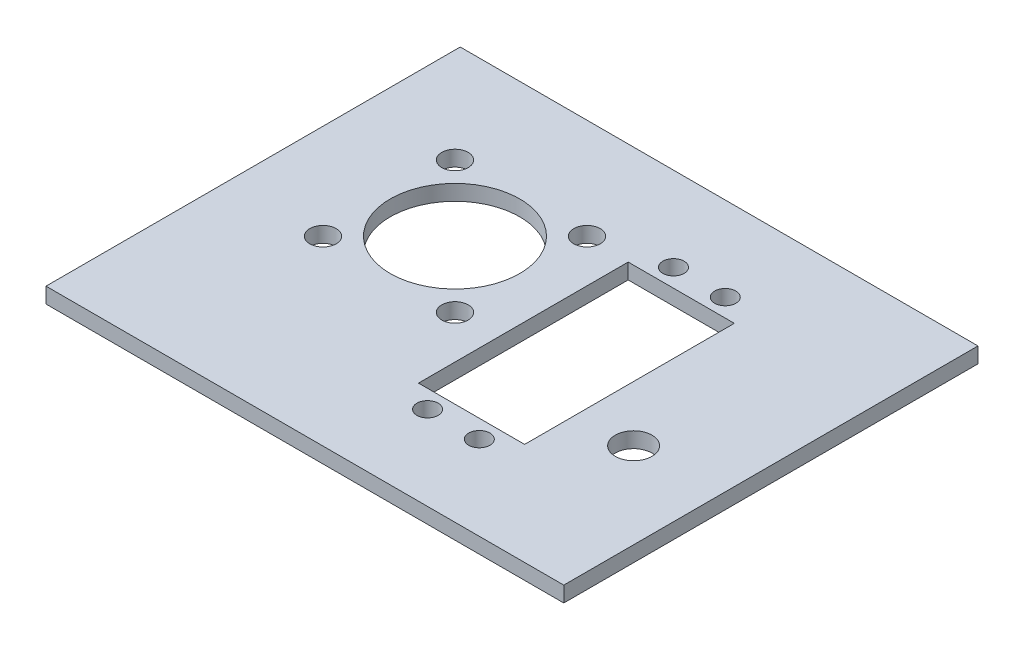
ISO-10303-21;
HEADER;
FILE_DESCRIPTION(('STEP AP214'),'2;1');
FILE_NAME('part.step','',(''),(''),'','','');
FILE_SCHEMA(('AUTOMOTIVE_DESIGN { 1 0 10303 214 1 1 1 1 }'));
ENDSEC;
DATA;
#1=APPLICATION_CONTEXT('core data for automotive mechanical design processes');
#2=APPLICATION_PROTOCOL_DEFINITION('international standard','automotive_design',2000,#1);
#3=PRODUCT_CONTEXT('',#1,'mechanical');
#4=PRODUCT('Part','Part','',(#3));
#5=PRODUCT_RELATED_PRODUCT_CATEGORY('part','',(#4));
#6=PRODUCT_DEFINITION_FORMATION('','',#4);
#7=PRODUCT_DEFINITION_CONTEXT('part definition',#1,'design');
#8=PRODUCT_DEFINITION('design','',#6,#7);
#9=PRODUCT_DEFINITION_SHAPE('','',#8);
#10=(LENGTH_UNIT() NAMED_UNIT(*) SI_UNIT(.MILLI.,.METRE.));
#11=(NAMED_UNIT(*) PLANE_ANGLE_UNIT() SI_UNIT($,.RADIAN.));
#12=(NAMED_UNIT(*) SI_UNIT($,.STERADIAN.) SOLID_ANGLE_UNIT());
#13=UNCERTAINTY_MEASURE_WITH_UNIT(LENGTH_MEASURE(1.E-05),#10,'distance_accuracy_value','');
#14=(GEOMETRIC_REPRESENTATION_CONTEXT(3) GLOBAL_UNCERTAINTY_ASSIGNED_CONTEXT((#13)) GLOBAL_UNIT_ASSIGNED_CONTEXT((#10,
#11,#12)) REPRESENTATION_CONTEXT('',''));
#15=CARTESIAN_POINT('',(0.,0.,0.));
#16=DIRECTION('',(0.,0.,1.));
#17=DIRECTION('',(1.,0.,0.));
#18=AXIS2_PLACEMENT_3D('',#15,#16,#17);
#19=CARTESIAN_POINT('',(0.,3.,-11.4110340583505));
#20=DIRECTION('',(0.,0.,-1.));
#21=DIRECTION('',(-1.,0.,0.));
#22=AXIS2_PLACEMENT_3D('',#19,#20,#21);
#23=PLANE('',#22);
#24=DIRECTION('',(1.,0.,0.));
#25=VECTOR('',#24,1.);
#26=CARTESIAN_POINT('',(0.,0.,-11.4110340583505));
#27=LINE('',#26,#25);
#28=CARTESIAN_POINT('',(13.5251162978277,0.,-11.4110340583505));
#29=VERTEX_POINT('',#28);
#30=CARTESIAN_POINT('',(34.0251162978277,0.,-11.4110340583505));
#31=VERTEX_POINT('',#30);
#32=EDGE_CURVE('E182',#29,#31,#27,.T.);
#33=ORIENTED_EDGE('',*,*,#32,.T.);
#34=DIRECTION('',(0.,-1.,0.));
#35=VECTOR('',#34,1.);
#36=CARTESIAN_POINT('',(34.0251162978277,3.,-11.4110340583505));
#37=LINE('',#36,#35);
#38=CARTESIAN_POINT('',(34.0251162978277,3.,-11.4110340583505));
#39=VERTEX_POINT('',#38);
#40=EDGE_CURVE('E11',#39,#31,#37,.T.);
#41=ORIENTED_EDGE('',*,*,#40,.F.);
#42=DIRECTION('',(1.,0.,0.));
#43=VECTOR('',#42,1.);
#44=CARTESIAN_POINT('',(0.,3.,-11.4110340583505));
#45=LINE('',#44,#43);
#46=CARTESIAN_POINT('',(13.5251162978277,3.,-11.4110340583505));
#47=VERTEX_POINT('',#46);
#48=EDGE_CURVE('E123',#47,#39,#45,.T.);
#49=ORIENTED_EDGE('',*,*,#48,.F.);
#50=DIRECTION('',(0.,-1.,0.));
#51=VECTOR('',#50,1.);
#52=CARTESIAN_POINT('',(13.5251162978277,3.,-11.4110340583505));
#53=LINE('',#52,#51);
#54=EDGE_CURVE('E63',#47,#29,#53,.T.);
#55=ORIENTED_EDGE('',*,*,#54,.T.);
#56=EDGE_LOOP('',(#33,#41,#49,#55));
#57=FACE_BOUND('',#56,.T.);
#58=ADVANCED_FACE('F44',(#57),#23,.F.);
#59=CARTESIAN_POINT('',(34.0251162978277,3.,0.));
#60=DIRECTION('',(1.,0.,0.));
#61=DIRECTION('',(0.,0.,-1.));
#62=AXIS2_PLACEMENT_3D('',#59,#60,#61);
#63=PLANE('',#62);
#64=DIRECTION('',(0.,0.,1.));
#65=VECTOR('',#64,1.);
#66=CARTESIAN_POINT('',(34.0251162978277,0.,0.));
#67=LINE('',#66,#65);
#68=CARTESIAN_POINT('',(34.0251162978277,0.,29.0889659416495));
#69=VERTEX_POINT('',#68);
#70=EDGE_CURVE('E129',#31,#69,#67,.T.);
#71=ORIENTED_EDGE('',*,*,#70,.T.);
#72=DIRECTION('',(0.,-1.,0.));
#73=VECTOR('',#72,1.);
#74=CARTESIAN_POINT('',(34.0251162978277,3.,29.0889659416495));
#75=LINE('',#74,#73);
#76=CARTESIAN_POINT('',(34.0251162978277,3.,29.0889659416495));
#77=VERTEX_POINT('',#76);
#78=EDGE_CURVE('E54',#77,#69,#75,.T.);
#79=ORIENTED_EDGE('',*,*,#78,.F.);
#80=DIRECTION('',(0.,0.,1.));
#81=VECTOR('',#80,1.);
#82=CARTESIAN_POINT('',(34.0251162978277,3.,0.));
#83=LINE('',#82,#81);
#84=EDGE_CURVE('E117',#39,#77,#83,.T.);
#85=ORIENTED_EDGE('',*,*,#84,.F.);
#86=ORIENTED_EDGE('',*,*,#40,.T.);
#87=EDGE_LOOP('',(#71,#79,#85,#86));
#88=FACE_BOUND('',#87,.T.);
#89=ADVANCED_FACE('F128',(#88),#63,.F.);
#90=CARTESIAN_POINT('',(0.,3.,29.0889659416495));
#91=DIRECTION('',(0.,0.,-1.));
#92=DIRECTION('',(-1.,0.,0.));
#93=AXIS2_PLACEMENT_3D('',#90,#91,#92);
#94=PLANE('',#93);
#95=DIRECTION('',(1.,0.,0.));
#96=VECTOR('',#95,1.);
#97=CARTESIAN_POINT('',(0.,0.,29.0889659416495));
#98=LINE('',#97,#96);
#99=CARTESIAN_POINT('',(13.5251162978277,0.,29.0889659416495));
#100=VERTEX_POINT('',#99);
#101=EDGE_CURVE('E185',#100,#69,#98,.T.);
#102=ORIENTED_EDGE('',*,*,#101,.F.);
#103=DIRECTION('',(0.,-1.,0.));
#104=VECTOR('',#103,1.);
#105=CARTESIAN_POINT('',(13.5251162978277,3.,29.0889659416495));
#106=LINE('',#105,#104);
#107=CARTESIAN_POINT('',(13.5251162978277,3.,29.0889659416495));
#108=VERTEX_POINT('',#107);
#109=EDGE_CURVE('E89',#108,#100,#106,.T.);
#110=ORIENTED_EDGE('',*,*,#109,.F.);
#111=DIRECTION('',(1.,0.,0.));
#112=VECTOR('',#111,1.);
#113=CARTESIAN_POINT('',(0.,3.,29.0889659416495));
#114=LINE('',#113,#112);
#115=EDGE_CURVE('E122',#108,#77,#114,.T.);
#116=ORIENTED_EDGE('',*,*,#115,.T.);
#117=ORIENTED_EDGE('',*,*,#78,.T.);
#118=EDGE_LOOP('',(#102,#110,#116,#117));
#119=FACE_BOUND('',#118,.T.);
#120=ADVANCED_FACE('F133',(#119),#94,.T.);
#121=CARTESIAN_POINT('',(61.3367190973659,3.,0.));
#122=DIRECTION('',(1.,0.,0.));
#123=DIRECTION('',(0.,0.,-1.));
#124=AXIS2_PLACEMENT_3D('',#121,#122,#123);
#125=PLANE('',#124);
#126=DIRECTION('',(0.,0.,1.));
#127=VECTOR('',#126,1.);
#128=CARTESIAN_POINT('',(61.3367190973659,0.,0.));
#129=LINE('',#128,#127);
#130=CARTESIAN_POINT('',(61.3367190973659,0.,-31.1610340583505));
#131=VERTEX_POINT('',#130);
#132=CARTESIAN_POINT('',(61.3367190973659,0.,48.8389659416495));
#133=VERTEX_POINT('',#132);
#134=EDGE_CURVE('E170',#131,#133,#129,.T.);
#135=ORIENTED_EDGE('',*,*,#134,.F.);
#136=DIRECTION('',(0.,-1.,0.));
#137=VECTOR('',#136,1.);
#138=CARTESIAN_POINT('',(61.3367190973659,3.,-31.1610340583505));
#139=LINE('',#138,#137);
#140=CARTESIAN_POINT('',(61.3367190973659,3.,-31.1610340583505));
#141=VERTEX_POINT('',#140);
#142=EDGE_CURVE('E48',#141,#131,#139,.T.);
#143=ORIENTED_EDGE('',*,*,#142,.F.);
#144=DIRECTION('',(0.,0.,1.));
#145=VECTOR('',#144,1.);
#146=CARTESIAN_POINT('',(61.3367190973659,3.,0.));
#147=LINE('',#146,#145);
#148=CARTESIAN_POINT('',(61.3367190973659,3.,48.8389659416495));
#149=VERTEX_POINT('',#148);
#150=EDGE_CURVE('E221',#141,#149,#147,.T.);
#151=ORIENTED_EDGE('',*,*,#150,.T.);
#152=DIRECTION('',(0.,-1.,0.));
#153=VECTOR('',#152,1.);
#154=CARTESIAN_POINT('',(61.3367190973659,3.,48.8389659416495));
#155=LINE('',#154,#153);
#156=EDGE_CURVE('E136',#149,#133,#155,.T.);
#157=ORIENTED_EDGE('',*,*,#156,.T.);
#158=EDGE_LOOP('',(#135,#143,#151,#157));
#159=FACE_BOUND('',#158,.T.);
#160=ADVANCED_FACE('F206',(#159),#125,.T.);
#161=CARTESIAN_POINT('',(0.,3.,-31.1610340583505));
#162=DIRECTION('',(0.,0.,-1.));
#163=DIRECTION('',(-1.,0.,0.));
#164=AXIS2_PLACEMENT_3D('',#161,#162,#163);
#165=PLANE('',#164);
#166=DIRECTION('',(1.,0.,0.));
#167=VECTOR('',#166,1.);
#168=CARTESIAN_POINT('',(0.,0.,-31.1610340583505));
#169=LINE('',#168,#167);
#170=CARTESIAN_POINT('',(-38.6632809026341,0.,-31.1610340583505));
#171=VERTEX_POINT('',#170);
#172=EDGE_CURVE('E173',#171,#131,#169,.T.);
#173=ORIENTED_EDGE('',*,*,#172,.F.);
#174=DIRECTION('',(0.,-1.,0.));
#175=VECTOR('',#174,1.);
#176=CARTESIAN_POINT('',(-38.6632809026341,3.,-31.1610340583505));
#177=LINE('',#176,#175);
#178=CARTESIAN_POINT('',(-38.6632809026341,3.,-31.1610340583505));
#179=VERTEX_POINT('',#178);
#180=EDGE_CURVE('E196',#179,#171,#177,.T.);
#181=ORIENTED_EDGE('',*,*,#180,.F.);
#182=DIRECTION('',(1.,0.,0.));
#183=VECTOR('',#182,1.);
#184=CARTESIAN_POINT('',(0.,3.,-31.1610340583505));
#185=LINE('',#184,#183);
#186=EDGE_CURVE('E205',#179,#141,#185,.T.);
#187=ORIENTED_EDGE('',*,*,#186,.T.);
#188=ORIENTED_EDGE('',*,*,#142,.T.);
#189=EDGE_LOOP('',(#173,#181,#187,#188));
#190=FACE_BOUND('',#189,.T.);
#191=ADVANCED_FACE('F203',(#190),#165,.T.);
#192=CARTESIAN_POINT('',(-38.6632809026341,3.,0.));
#193=DIRECTION('',(1.,0.,0.));
#194=DIRECTION('',(0.,0.,-1.));
#195=AXIS2_PLACEMENT_3D('',#192,#193,#194);
#196=PLANE('',#195);
#197=DIRECTION('',(0.,0.,1.));
#198=VECTOR('',#197,1.);
#199=CARTESIAN_POINT('',(-38.6632809026341,0.,0.));
#200=LINE('',#199,#198);
#201=CARTESIAN_POINT('',(-38.6632809026341,0.,48.8389659416495));
#202=VERTEX_POINT('',#201);
#203=EDGE_CURVE('E176',#171,#202,#200,.T.);
#204=ORIENTED_EDGE('',*,*,#203,.T.);
#205=DIRECTION('',(0.,-1.,0.));
#206=VECTOR('',#205,1.);
#207=CARTESIAN_POINT('',(-38.6632809026341,3.,48.8389659416495));
#208=LINE('',#207,#206);
#209=CARTESIAN_POINT('',(-38.6632809026341,3.,48.8389659416495));
#210=VERTEX_POINT('',#209);
#211=EDGE_CURVE('E194',#210,#202,#208,.T.);
#212=ORIENTED_EDGE('',*,*,#211,.F.);
#213=DIRECTION('',(0.,0.,1.));
#214=VECTOR('',#213,1.);
#215=CARTESIAN_POINT('',(-38.6632809026341,3.,0.));
#216=LINE('',#215,#214);
#217=EDGE_CURVE('E214',#179,#210,#216,.T.);
#218=ORIENTED_EDGE('',*,*,#217,.F.);
#219=ORIENTED_EDGE('',*,*,#180,.T.);
#220=EDGE_LOOP('',(#204,#212,#218,#219));
#221=FACE_BOUND('',#220,.T.);
#222=ADVANCED_FACE('F212',(#221),#196,.F.);
#223=CARTESIAN_POINT('',(0.,3.,48.8389659416495));
#224=DIRECTION('',(0.,0.,-1.));
#225=DIRECTION('',(-1.,0.,0.));
#226=AXIS2_PLACEMENT_3D('',#223,#224,#225);
#227=PLANE('',#226);
#228=DIRECTION('',(1.,0.,0.));
#229=VECTOR('',#228,1.);
#230=CARTESIAN_POINT('',(0.,0.,48.8389659416495));
#231=LINE('',#230,#229);
#232=EDGE_CURVE('E179',#202,#133,#231,.T.);
#233=ORIENTED_EDGE('',*,*,#232,.T.);
#234=ORIENTED_EDGE('',*,*,#156,.F.);
#235=DIRECTION('',(1.,0.,0.));
#236=VECTOR('',#235,1.);
#237=CARTESIAN_POINT('',(0.,3.,48.8389659416495));
#238=LINE('',#237,#236);
#239=EDGE_CURVE('E217',#210,#149,#238,.T.);
#240=ORIENTED_EDGE('',*,*,#239,.F.);
#241=ORIENTED_EDGE('',*,*,#211,.T.);
#242=EDGE_LOOP('',(#233,#234,#240,#241));
#243=FACE_BOUND('',#242,.T.);
#244=ADVANCED_FACE('F216',(#243),#227,.F.);
#245=CARTESIAN_POINT('',(-7.51877009888325,3.,0.993104788287176));
#246=DIRECTION('',(0.,-1.,0.));
#247=DIRECTION('',(0.,0.,-1.));
#248=AXIS2_PLACEMENT_3D('',#245,#246,#247);
#249=CYLINDRICAL_SURFACE('',#248,12.5);
#250=CARTESIAN_POINT('',(-7.51877009888325,3.,0.993104788287176));
#251=DIRECTION('',(0.,1.,0.));
#252=DIRECTION('',(0.,0.,1.));
#253=AXIS2_PLACEMENT_3D('',#250,#251,#252);
#254=CIRCLE('',#253,12.5);
#255=CARTESIAN_POINT('',(-7.51877009888325,3.,13.4931047882872));
#256=VERTEX_POINT('',#255);
#257=EDGE_CURVE('E225',#256,#256,#254,.T.);
#258=ORIENTED_EDGE('',*,*,#257,.T.);
#259=EDGE_LOOP('',(#258));
#260=FACE_BOUND('',#259,.T.);
#261=CARTESIAN_POINT('',(-7.51877009888325,0.,0.993104788287176));
#262=DIRECTION('',(0.,1.,0.));
#263=DIRECTION('',(0.,0.,1.));
#264=AXIS2_PLACEMENT_3D('',#261,#262,#263);
#265=CIRCLE('',#264,12.5);
#266=CARTESIAN_POINT('',(-7.51877009888325,0.,13.4931047882872));
#267=VERTEX_POINT('',#266);
#268=EDGE_CURVE('E167',#267,#267,#265,.T.);
#269=ORIENTED_EDGE('',*,*,#268,.F.);
#270=EDGE_LOOP('',(#269));
#271=FACE_BOUND('',#270,.T.);
#272=ADVANCED_FACE('F279',(#260,#271),#249,.F.);
#273=CARTESIAN_POINT('',(-20.2687700988833,3.,-11.7568952117128));
#274=DIRECTION('',(0.,-1.,0.));
#275=DIRECTION('',(0.,0.,-1.));
#276=AXIS2_PLACEMENT_3D('',#273,#274,#275);
#277=CYLINDRICAL_SURFACE('',#276,2.55);
#278=CARTESIAN_POINT('',(-20.2687700988833,3.,-11.7568952117128));
#279=DIRECTION('',(0.,1.,0.));
#280=DIRECTION('',(0.,0.,1.));
#281=AXIS2_PLACEMENT_3D('',#278,#279,#280);
#282=CIRCLE('',#281,2.55);
#283=CARTESIAN_POINT('',(-20.2687700988833,3.,-9.20689521171283));
#284=VERTEX_POINT('',#283);
#285=EDGE_CURVE('E228',#284,#284,#282,.T.);
#286=ORIENTED_EDGE('',*,*,#285,.T.);
#287=EDGE_LOOP('',(#286));
#288=FACE_BOUND('',#287,.T.);
#289=CARTESIAN_POINT('',(-20.2687700988833,0.,-11.7568952117128));
#290=DIRECTION('',(0.,1.,0.));
#291=DIRECTION('',(0.,0.,1.));
#292=AXIS2_PLACEMENT_3D('',#289,#290,#291);
#293=CIRCLE('',#292,2.55);
#294=CARTESIAN_POINT('',(-20.2687700988833,0.,-9.20689521171283));
#295=VERTEX_POINT('',#294);
#296=EDGE_CURVE('E164',#295,#295,#293,.T.);
#297=ORIENTED_EDGE('',*,*,#296,.F.);
#298=EDGE_LOOP('',(#297));
#299=FACE_BOUND('',#298,.T.);
#300=ADVANCED_FACE('F282',(#288,#299),#277,.F.);
#301=CARTESIAN_POINT('',(5.23122990111676,3.,-11.7568952117128));
#302=DIRECTION('',(0.,-1.,0.));
#303=DIRECTION('',(0.,0.,-1.));
#304=AXIS2_PLACEMENT_3D('',#301,#302,#303);
#305=CYLINDRICAL_SURFACE('',#304,2.55);
#306=CARTESIAN_POINT('',(5.23122990111676,3.,-11.7568952117128));
#307=DIRECTION('',(0.,1.,0.));
#308=DIRECTION('',(0.,0.,1.));
#309=AXIS2_PLACEMENT_3D('',#306,#307,#308);
#310=CIRCLE('',#309,2.55);
#311=CARTESIAN_POINT('',(5.23122990111676,3.,-9.20689521171283));
#312=VERTEX_POINT('',#311);
#313=EDGE_CURVE('E231',#312,#312,#310,.T.);
#314=ORIENTED_EDGE('',*,*,#313,.T.);
#315=EDGE_LOOP('',(#314));
#316=FACE_BOUND('',#315,.T.);
#317=CARTESIAN_POINT('',(5.23122990111676,0.,-11.7568952117128));
#318=DIRECTION('',(0.,1.,0.));
#319=DIRECTION('',(0.,0.,1.));
#320=AXIS2_PLACEMENT_3D('',#317,#318,#319);
#321=CIRCLE('',#320,2.55);
#322=CARTESIAN_POINT('',(5.23122990111676,0.,-9.20689521171283));
#323=VERTEX_POINT('',#322);
#324=EDGE_CURVE('E161',#323,#323,#321,.T.);
#325=ORIENTED_EDGE('',*,*,#324,.F.);
#326=EDGE_LOOP('',(#325));
#327=FACE_BOUND('',#326,.T.);
#328=ADVANCED_FACE('F311',(#316,#327),#305,.F.);
#329=CARTESIAN_POINT('',(5.23122990111676,3.,13.7431047882872));
#330=DIRECTION('',(0.,-1.,0.));
#331=DIRECTION('',(0.,0.,-1.));
#332=AXIS2_PLACEMENT_3D('',#329,#330,#331);
#333=CYLINDRICAL_SURFACE('',#332,2.55);
#334=CARTESIAN_POINT('',(5.23122990111676,3.,13.7431047882872));
#335=DIRECTION('',(0.,1.,0.));
#336=DIRECTION('',(0.,0.,1.));
#337=AXIS2_PLACEMENT_3D('',#334,#335,#336);
#338=CIRCLE('',#337,2.55);
#339=CARTESIAN_POINT('',(5.23122990111676,3.,16.2931047882872));
#340=VERTEX_POINT('',#339);
#341=EDGE_CURVE('E234',#340,#340,#338,.T.);
#342=ORIENTED_EDGE('',*,*,#341,.T.);
#343=EDGE_LOOP('',(#342));
#344=FACE_BOUND('',#343,.T.);
#345=CARTESIAN_POINT('',(5.23122990111676,0.,13.7431047882872));
#346=DIRECTION('',(0.,1.,0.));
#347=DIRECTION('',(0.,0.,1.));
#348=AXIS2_PLACEMENT_3D('',#345,#346,#347);
#349=CIRCLE('',#348,2.55);
#350=CARTESIAN_POINT('',(5.23122990111676,0.,16.2931047882872));
#351=VERTEX_POINT('',#350);
#352=EDGE_CURVE('E158',#351,#351,#349,.T.);
#353=ORIENTED_EDGE('',*,*,#352,.F.);
#354=EDGE_LOOP('',(#353));
#355=FACE_BOUND('',#354,.T.);
#356=ADVANCED_FACE('F315',(#344,#355),#333,.F.);
#357=CARTESIAN_POINT('',(-20.2687700988832,3.,13.7431047882872));
#358=DIRECTION('',(0.,-1.,0.));
#359=DIRECTION('',(0.,0.,-1.));
#360=AXIS2_PLACEMENT_3D('',#357,#358,#359);
#361=CYLINDRICAL_SURFACE('',#360,2.55);
#362=CARTESIAN_POINT('',(-20.2687700988832,3.,13.7431047882872));
#363=DIRECTION('',(0.,1.,0.));
#364=DIRECTION('',(0.,0.,1.));
#365=AXIS2_PLACEMENT_3D('',#362,#363,#364);
#366=CIRCLE('',#365,2.55);
#367=CARTESIAN_POINT('',(-20.2687700988832,3.,16.2931047882872));
#368=VERTEX_POINT('',#367);
#369=EDGE_CURVE('E237',#368,#368,#366,.T.);
#370=ORIENTED_EDGE('',*,*,#369,.T.);
#371=EDGE_LOOP('',(#370));
#372=FACE_BOUND('',#371,.T.);
#373=CARTESIAN_POINT('',(-20.2687700988832,0.,13.7431047882872));
#374=DIRECTION('',(0.,1.,0.));
#375=DIRECTION('',(0.,0.,1.));
#376=AXIS2_PLACEMENT_3D('',#373,#374,#375);
#377=CIRCLE('',#376,2.55);
#378=CARTESIAN_POINT('',(-20.2687700988832,0.,16.2931047882872));
#379=VERTEX_POINT('',#378);
#380=EDGE_CURVE('E155',#379,#379,#377,.T.);
#381=ORIENTED_EDGE('',*,*,#380,.F.);
#382=EDGE_LOOP('',(#381));
#383=FACE_BOUND('',#382,.T.);
#384=ADVANCED_FACE('F319',(#372,#383),#361,.F.);
#385=CARTESIAN_POINT('',(18.7751162978277,3.,-14.9110340583505));
#386=DIRECTION('',(0.,-1.,0.));
#387=DIRECTION('',(0.,0.,-1.));
#388=AXIS2_PLACEMENT_3D('',#385,#386,#387);
#389=CYLINDRICAL_SURFACE('',#388,2.05);
#390=CARTESIAN_POINT('',(18.7751162978277,3.,-14.9110340583505));
#391=DIRECTION('',(0.,1.,0.));
#392=DIRECTION('',(0.,0.,1.));
#393=AXIS2_PLACEMENT_3D('',#390,#391,#392);
#394=CIRCLE('',#393,2.05);
#395=CARTESIAN_POINT('',(18.7751162978277,3.,-12.8610340583505));
#396=VERTEX_POINT('',#395);
#397=EDGE_CURVE('E240',#396,#396,#394,.T.);
#398=ORIENTED_EDGE('',*,*,#397,.T.);
#399=EDGE_LOOP('',(#398));
#400=FACE_BOUND('',#399,.T.);
#401=CARTESIAN_POINT('',(18.7751162978277,0.,-14.9110340583505));
#402=DIRECTION('',(0.,1.,0.));
#403=DIRECTION('',(0.,0.,1.));
#404=AXIS2_PLACEMENT_3D('',#401,#402,#403);
#405=CIRCLE('',#404,2.05);
#406=CARTESIAN_POINT('',(18.7751162978277,0.,-12.8610340583505));
#407=VERTEX_POINT('',#406);
#408=EDGE_CURVE('E152',#407,#407,#405,.T.);
#409=ORIENTED_EDGE('',*,*,#408,.F.);
#410=EDGE_LOOP('',(#409));
#411=FACE_BOUND('',#410,.T.);
#412=ADVANCED_FACE('F323',(#400,#411),#389,.F.);
#413=CARTESIAN_POINT('',(28.7751162978277,3.,-14.9110340583505));
#414=DIRECTION('',(0.,-1.,0.));
#415=DIRECTION('',(0.,0.,-1.));
#416=AXIS2_PLACEMENT_3D('',#413,#414,#415);
#417=CYLINDRICAL_SURFACE('',#416,2.05);
#418=CARTESIAN_POINT('',(28.7751162978277,3.,-14.9110340583505));
#419=DIRECTION('',(0.,1.,0.));
#420=DIRECTION('',(0.,0.,1.));
#421=AXIS2_PLACEMENT_3D('',#418,#419,#420);
#422=CIRCLE('',#421,2.05);
#423=CARTESIAN_POINT('',(28.7751162978277,3.,-12.8610340583505));
#424=VERTEX_POINT('',#423);
#425=EDGE_CURVE('E243',#424,#424,#422,.T.);
#426=ORIENTED_EDGE('',*,*,#425,.T.);
#427=EDGE_LOOP('',(#426));
#428=FACE_BOUND('',#427,.T.);
#429=CARTESIAN_POINT('',(28.7751162978277,0.,-14.9110340583505));
#430=DIRECTION('',(0.,1.,0.));
#431=DIRECTION('',(0.,0.,1.));
#432=AXIS2_PLACEMENT_3D('',#429,#430,#431);
#433=CIRCLE('',#432,2.05);
#434=CARTESIAN_POINT('',(28.7751162978277,0.,-12.8610340583505));
#435=VERTEX_POINT('',#434);
#436=EDGE_CURVE('E149',#435,#435,#433,.T.);
#437=ORIENTED_EDGE('',*,*,#436,.F.);
#438=EDGE_LOOP('',(#437));
#439=FACE_BOUND('',#438,.T.);
#440=ADVANCED_FACE('F327',(#428,#439),#417,.F.);
#441=CARTESIAN_POINT('',(18.7751162978277,3.,32.5889659416495));
#442=DIRECTION('',(0.,-1.,0.));
#443=DIRECTION('',(0.,0.,-1.));
#444=AXIS2_PLACEMENT_3D('',#441,#442,#443);
#445=CYLINDRICAL_SURFACE('',#444,2.05);
#446=CARTESIAN_POINT('',(18.7751162978277,3.,32.5889659416495));
#447=DIRECTION('',(0.,1.,0.));
#448=DIRECTION('',(0.,0.,1.));
#449=AXIS2_PLACEMENT_3D('',#446,#447,#448);
#450=CIRCLE('',#449,2.05);
#451=CARTESIAN_POINT('',(18.7751162978277,3.,34.6389659416496));
#452=VERTEX_POINT('',#451);
#453=EDGE_CURVE('E246',#452,#452,#450,.T.);
#454=ORIENTED_EDGE('',*,*,#453,.T.);
#455=EDGE_LOOP('',(#454));
#456=FACE_BOUND('',#455,.T.);
#457=CARTESIAN_POINT('',(18.7751162978277,0.,32.5889659416495));
#458=DIRECTION('',(0.,1.,0.));
#459=DIRECTION('',(0.,0.,1.));
#460=AXIS2_PLACEMENT_3D('',#457,#458,#459);
#461=CIRCLE('',#460,2.05);
#462=CARTESIAN_POINT('',(18.7751162978277,0.,34.6389659416496));
#463=VERTEX_POINT('',#462);
#464=EDGE_CURVE('E146',#463,#463,#461,.T.);
#465=ORIENTED_EDGE('',*,*,#464,.F.);
#466=EDGE_LOOP('',(#465));
#467=FACE_BOUND('',#466,.T.);
#468=ADVANCED_FACE('F331',(#456,#467),#445,.F.);
#469=CARTESIAN_POINT('',(28.7751162978277,3.,32.5889659416495));
#470=DIRECTION('',(0.,-1.,0.));
#471=DIRECTION('',(0.,0.,-1.));
#472=AXIS2_PLACEMENT_3D('',#469,#470,#471);
#473=CYLINDRICAL_SURFACE('',#472,2.05);
#474=CARTESIAN_POINT('',(28.7751162978277,3.,32.5889659416495));
#475=DIRECTION('',(0.,1.,0.));
#476=DIRECTION('',(0.,0.,1.));
#477=AXIS2_PLACEMENT_3D('',#474,#475,#476);
#478=CIRCLE('',#477,2.05);
#479=CARTESIAN_POINT('',(28.7751162978277,3.,34.6389659416496));
#480=VERTEX_POINT('',#479);
#481=EDGE_CURVE('E249',#480,#480,#478,.T.);
#482=ORIENTED_EDGE('',*,*,#481,.T.);
#483=EDGE_LOOP('',(#482));
#484=FACE_BOUND('',#483,.T.);
#485=CARTESIAN_POINT('',(28.7751162978277,0.,32.5889659416495));
#486=DIRECTION('',(0.,1.,0.));
#487=DIRECTION('',(0.,0.,1.));
#488=AXIS2_PLACEMENT_3D('',#485,#486,#487);
#489=CIRCLE('',#488,2.05);
#490=CARTESIAN_POINT('',(28.7751162978277,0.,34.6389659416496));
#491=VERTEX_POINT('',#490);
#492=EDGE_CURVE('E143',#491,#491,#489,.T.);
#493=ORIENTED_EDGE('',*,*,#492,.F.);
#494=EDGE_LOOP('',(#493));
#495=FACE_BOUND('',#494,.T.);
#496=ADVANCED_FACE('F334',(#484,#495),#473,.F.);
#497=CARTESIAN_POINT('',(44.7751162978277,3.,18.7889659416495));
#498=DIRECTION('',(0.,-1.,0.));
#499=DIRECTION('',(0.,0.,-1.));
#500=AXIS2_PLACEMENT_3D('',#497,#498,#499);
#501=CYLINDRICAL_SURFACE('',#500,3.55);
#502=CARTESIAN_POINT('',(44.7751162978277,3.,18.7889659416495));
#503=DIRECTION('',(0.,1.,0.));
#504=DIRECTION('',(0.,0.,1.));
#505=AXIS2_PLACEMENT_3D('',#502,#503,#504);
#506=CIRCLE('',#505,3.55);
#507=CARTESIAN_POINT('',(44.7751162978277,3.,22.3389659416495));
#508=VERTEX_POINT('',#507);
#509=EDGE_CURVE('E190',#508,#508,#506,.T.);
#510=ORIENTED_EDGE('',*,*,#509,.T.);
#511=EDGE_LOOP('',(#510));
#512=FACE_BOUND('',#511,.T.);
#513=CARTESIAN_POINT('',(44.7751162978277,0.,18.7889659416495));
#514=DIRECTION('',(0.,1.,0.));
#515=DIRECTION('',(0.,0.,1.));
#516=AXIS2_PLACEMENT_3D('',#513,#514,#515);
#517=CIRCLE('',#516,3.55);
#518=CARTESIAN_POINT('',(44.7751162978277,0.,22.3389659416495));
#519=VERTEX_POINT('',#518);
#520=EDGE_CURVE('E140',#519,#519,#517,.T.);
#521=ORIENTED_EDGE('',*,*,#520,.F.);
#522=EDGE_LOOP('',(#521));
#523=FACE_BOUND('',#522,.T.);
#524=ADVANCED_FACE('F46',(#512,#523),#501,.F.);
#525=CARTESIAN_POINT('',(13.5251162978277,3.,0.));
#526=DIRECTION('',(1.,0.,0.));
#527=DIRECTION('',(0.,0.,-1.));
#528=AXIS2_PLACEMENT_3D('',#525,#526,#527);
#529=PLANE('',#528);
#530=DIRECTION('',(0.,0.,1.));
#531=VECTOR('',#530,1.);
#532=CARTESIAN_POINT('',(13.5251162978277,0.,0.));
#533=LINE('',#532,#531);
#534=EDGE_CURVE('E187',#29,#100,#533,.T.);
#535=ORIENTED_EDGE('',*,*,#534,.F.);
#536=ORIENTED_EDGE('',*,*,#54,.F.);
#537=DIRECTION('',(0.,0.,1.));
#538=VECTOR('',#537,1.);
#539=CARTESIAN_POINT('',(13.5251162978277,3.,0.));
#540=LINE('',#539,#538);
#541=EDGE_CURVE('E134',#47,#108,#540,.T.);
#542=ORIENTED_EDGE('',*,*,#541,.T.);
#543=ORIENTED_EDGE('',*,*,#109,.T.);
#544=EDGE_LOOP('',(#535,#536,#542,#543));
#545=FACE_BOUND('',#544,.T.);
#546=ADVANCED_FACE('F259',(#545),#529,.T.);
#547=CARTESIAN_POINT('',(0.,3.,0.));
#548=DIRECTION('',(0.,1.,0.));
#549=DIRECTION('',(0.,0.,1.));
#550=AXIS2_PLACEMENT_3D('',#547,#548,#549);
#551=PLANE('',#550);
#552=ORIENTED_EDGE('',*,*,#509,.F.);
#553=EDGE_LOOP('',(#552));
#554=FACE_BOUND('',#553,.T.);
#555=ORIENTED_EDGE('',*,*,#481,.F.);
#556=EDGE_LOOP('',(#555));
#557=FACE_BOUND('',#556,.T.);
#558=ORIENTED_EDGE('',*,*,#453,.F.);
#559=EDGE_LOOP('',(#558));
#560=FACE_BOUND('',#559,.T.);
#561=ORIENTED_EDGE('',*,*,#425,.F.);
#562=EDGE_LOOP('',(#561));
#563=FACE_BOUND('',#562,.T.);
#564=ORIENTED_EDGE('',*,*,#397,.F.);
#565=EDGE_LOOP('',(#564));
#566=FACE_BOUND('',#565,.T.);
#567=ORIENTED_EDGE('',*,*,#369,.F.);
#568=EDGE_LOOP('',(#567));
#569=FACE_BOUND('',#568,.T.);
#570=ORIENTED_EDGE('',*,*,#341,.F.);
#571=EDGE_LOOP('',(#570));
#572=FACE_BOUND('',#571,.T.);
#573=ORIENTED_EDGE('',*,*,#313,.F.);
#574=EDGE_LOOP('',(#573));
#575=FACE_BOUND('',#574,.T.);
#576=ORIENTED_EDGE('',*,*,#285,.F.);
#577=EDGE_LOOP('',(#576));
#578=FACE_BOUND('',#577,.T.);
#579=ORIENTED_EDGE('',*,*,#257,.F.);
#580=EDGE_LOOP('',(#579));
#581=FACE_BOUND('',#580,.T.);
#582=ORIENTED_EDGE('',*,*,#150,.F.);
#583=ORIENTED_EDGE('',*,*,#186,.F.);
#584=ORIENTED_EDGE('',*,*,#217,.T.);
#585=ORIENTED_EDGE('',*,*,#239,.T.);
#586=EDGE_LOOP('',(#582,#583,#584,#585));
#587=FACE_BOUND('',#586,.T.);
#588=ORIENTED_EDGE('',*,*,#48,.T.);
#589=ORIENTED_EDGE('',*,*,#84,.T.);
#590=ORIENTED_EDGE('',*,*,#115,.F.);
#591=ORIENTED_EDGE('',*,*,#541,.F.);
#592=EDGE_LOOP('',(#588,#589,#590,#591));
#593=FACE_BOUND('',#592,.T.);
#594=ADVANCED_FACE('F119',(#554,#557,#560,#563,#566,#569,#572,#575,#578,#581,#587,#593),#551,.T.);
#595=CARTESIAN_POINT('',(0.,0.,0.));
#596=DIRECTION('',(0.,1.,0.));
#597=DIRECTION('',(0.,0.,1.));
#598=AXIS2_PLACEMENT_3D('',#595,#596,#597);
#599=PLANE('',#598);
#600=ORIENTED_EDGE('',*,*,#520,.T.);
#601=EDGE_LOOP('',(#600));
#602=FACE_BOUND('',#601,.T.);
#603=ORIENTED_EDGE('',*,*,#492,.T.);
#604=EDGE_LOOP('',(#603));
#605=FACE_BOUND('',#604,.T.);
#606=ORIENTED_EDGE('',*,*,#464,.T.);
#607=EDGE_LOOP('',(#606));
#608=FACE_BOUND('',#607,.T.);
#609=ORIENTED_EDGE('',*,*,#436,.T.);
#610=EDGE_LOOP('',(#609));
#611=FACE_BOUND('',#610,.T.);
#612=ORIENTED_EDGE('',*,*,#408,.T.);
#613=EDGE_LOOP('',(#612));
#614=FACE_BOUND('',#613,.T.);
#615=ORIENTED_EDGE('',*,*,#380,.T.);
#616=EDGE_LOOP('',(#615));
#617=FACE_BOUND('',#616,.T.);
#618=ORIENTED_EDGE('',*,*,#352,.T.);
#619=EDGE_LOOP('',(#618));
#620=FACE_BOUND('',#619,.T.);
#621=ORIENTED_EDGE('',*,*,#324,.T.);
#622=EDGE_LOOP('',(#621));
#623=FACE_BOUND('',#622,.T.);
#624=ORIENTED_EDGE('',*,*,#296,.T.);
#625=EDGE_LOOP('',(#624));
#626=FACE_BOUND('',#625,.T.);
#627=ORIENTED_EDGE('',*,*,#268,.T.);
#628=EDGE_LOOP('',(#627));
#629=FACE_BOUND('',#628,.T.);
#630=ORIENTED_EDGE('',*,*,#134,.T.);
#631=ORIENTED_EDGE('',*,*,#232,.F.);
#632=ORIENTED_EDGE('',*,*,#203,.F.);
#633=ORIENTED_EDGE('',*,*,#172,.T.);
#634=EDGE_LOOP('',(#630,#631,#632,#633));
#635=FACE_BOUND('',#634,.T.);
#636=ORIENTED_EDGE('',*,*,#32,.F.);
#637=ORIENTED_EDGE('',*,*,#534,.T.);
#638=ORIENTED_EDGE('',*,*,#101,.T.);
#639=ORIENTED_EDGE('',*,*,#70,.F.);
#640=EDGE_LOOP('',(#636,#637,#638,#639));
#641=FACE_BOUND('',#640,.T.);
#642=ADVANCED_FACE('F209',(#602,#605,#608,#611,#614,#617,#620,#623,#626,#629,#635,#641),#599,.F.);
#643=CLOSED_SHELL('',(#58,#89,#120,#160,#191,#222,#244,#272,#300,#328,#356,#384,#412,#440,#468,
#496,#524,#546,#594,#642));
#644=MANIFOLD_SOLID_BREP('B2',#643);
#645=ADVANCED_BREP_SHAPE_REPRESENTATION('',(#18,#644),#14);
#646=SHAPE_DEFINITION_REPRESENTATION(#9,#645);
ENDSEC;
END-ISO-10303-21;
